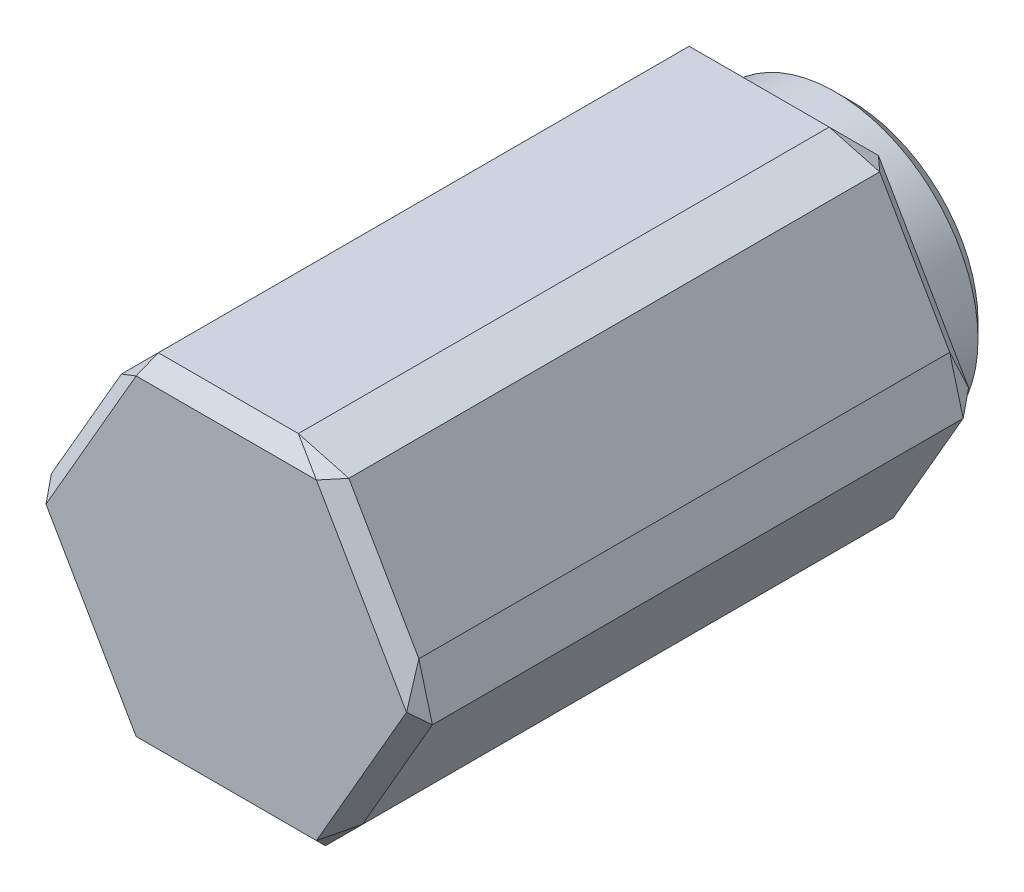
ISO-10303-21;
HEADER;
FILE_DESCRIPTION(('STEP AP214'),'2;1');
FILE_NAME('part.step','',(''),(''),'','','');
FILE_SCHEMA(('AUTOMOTIVE_DESIGN { 1 0 10303 214 1 1 1 1 }'));
ENDSEC;
DATA;
#1=APPLICATION_CONTEXT('core data for automotive mechanical design processes');
#2=APPLICATION_PROTOCOL_DEFINITION('international standard','automotive_design',2000,#1);
#3=PRODUCT_CONTEXT('',#1,'mechanical');
#4=PRODUCT('Part','Part','',(#3));
#5=PRODUCT_RELATED_PRODUCT_CATEGORY('part','',(#4));
#6=PRODUCT_DEFINITION_FORMATION('','',#4);
#7=PRODUCT_DEFINITION_CONTEXT('part definition',#1,'design');
#8=PRODUCT_DEFINITION('design','',#6,#7);
#9=PRODUCT_DEFINITION_SHAPE('','',#8);
#10=(LENGTH_UNIT() NAMED_UNIT(*) SI_UNIT(.MILLI.,.METRE.));
#11=(NAMED_UNIT(*) PLANE_ANGLE_UNIT() SI_UNIT($,.RADIAN.));
#12=(NAMED_UNIT(*) SI_UNIT($,.STERADIAN.) SOLID_ANGLE_UNIT());
#13=UNCERTAINTY_MEASURE_WITH_UNIT(LENGTH_MEASURE(1.E-05),#10,'distance_accuracy_value','');
#14=(GEOMETRIC_REPRESENTATION_CONTEXT(3) GLOBAL_UNCERTAINTY_ASSIGNED_CONTEXT((#13)) GLOBAL_UNIT_ASSIGNED_CONTEXT((#10,
#11,#12)) REPRESENTATION_CONTEXT('',''));
#15=CARTESIAN_POINT('',(0.,0.,0.));
#16=DIRECTION('',(0.,0.,1.));
#17=DIRECTION('',(1.,0.,0.));
#18=AXIS2_PLACEMENT_3D('',#15,#16,#17);
#19=CARTESIAN_POINT('',(0.,0.,0.));
#20=DIRECTION('',(0.,0.,1.));
#21=DIRECTION('',(1.,0.,0.));
#22=AXIS2_PLACEMENT_3D('',#19,#20,#21);
#23=PLANE('',#22);
#24=CARTESIAN_POINT('',(0.,0.,0.));
#25=DIRECTION('',(0.,0.,1.));
#26=DIRECTION('',(1.,0.,0.));
#27=AXIS2_PLACEMENT_3D('',#24,#25,#26);
#28=CIRCLE('',#27,4.07499999999999);
#29=CARTESIAN_POINT('',(4.07499999999999,0.,0.));
#30=VERTEX_POINT('',#29);
#31=EDGE_CURVE('E213',#30,#30,#28,.F.);
#32=ORIENTED_EDGE('',*,*,#31,.T.);
#33=EDGE_LOOP('',(#32));
#34=FACE_BOUND('',#33,.T.);
#35=CARTESIAN_POINT('',(0.,0.,0.));
#36=DIRECTION('',(0.,0.,1.));
#37=DIRECTION('',(1.,0.,0.));
#38=AXIS2_PLACEMENT_3D('',#35,#36,#37);
#39=CIRCLE('',#38,1.65000000000001);
#40=CARTESIAN_POINT('',(1.1832491571939,-1.14996583949262,0.));
#41=VERTEX_POINT('',#40);
#42=CARTESIAN_POINT('',(-1.1832491571939,-1.14996583949261,0.));
#43=VERTEX_POINT('',#42);
#44=EDGE_CURVE('E61',#41,#43,#39,.T.);
#45=ORIENTED_EDGE('',*,*,#44,.T.);
#46=DIRECTION('',(1.,0.,0.));
#47=VECTOR('',#46,1.);
#48=CARTESIAN_POINT('',(1.1832491571939,-1.14996583949262,0.));
#49=LINE('',#48,#47);
#50=EDGE_CURVE('E196',#43,#41,#49,.T.);
#51=ORIENTED_EDGE('',*,*,#50,.T.);
#52=EDGE_LOOP('',(#45,#51));
#53=FACE_BOUND('',#52,.T.);
#54=ADVANCED_FACE('F43',(#34,#53),#23,.F.);
#55=CARTESIAN_POINT('',(0.,0.,2.));
#56=DIRECTION('',(0.,0.,-1.));
#57=DIRECTION('',(-1.,0.,0.));
#58=AXIS2_PLACEMENT_3D('',#55,#56,#57);
#59=CYLINDRICAL_SURFACE('',#58,4.575);
#60=CARTESIAN_POINT('',(0.,0.,0.500000000000007));
#61=DIRECTION('',(0.,0.,1.));
#62=DIRECTION('',(1.,0.,0.));
#63=AXIS2_PLACEMENT_3D('',#60,#61,#62);
#64=CIRCLE('',#63,4.575);
#65=CARTESIAN_POINT('',(4.575,0.,0.500000000000007));
#66=VERTEX_POINT('',#65);
#67=EDGE_CURVE('E210',#66,#66,#64,.T.);
#68=ORIENTED_EDGE('',*,*,#67,.T.);
#69=EDGE_LOOP('',(#68));
#70=FACE_BOUND('',#69,.T.);
#71=CARTESIAN_POINT('',(0.,0.,2.));
#72=DIRECTION('',(0.,0.,1.));
#73=DIRECTION('',(1.,0.,0.));
#74=AXIS2_PLACEMENT_3D('',#71,#72,#73);
#75=CIRCLE('',#74,4.575);
#76=CARTESIAN_POINT('',(4.575,0.,2.));
#77=VERTEX_POINT('',#76);
#78=EDGE_CURVE('E207',#77,#77,#75,.T.);
#79=ORIENTED_EDGE('',*,*,#78,.F.);
#80=EDGE_LOOP('',(#79));
#81=FACE_BOUND('',#80,.T.);
#82=ADVANCED_FACE('F478',(#70,#81),#59,.T.);
#83=CARTESIAN_POINT('',(3.17542648054294,-5.5,20.));
#84=DIRECTION('',(-0.866025403784439,0.5,0.));
#85=DIRECTION('',(-0.5,-0.866025403784439,0.));
#86=AXIS2_PLACEMENT_3D('',#83,#84,#85);
#87=PLANE('',#86);
#88=DIRECTION('',(0.,0.,1.));
#89=VECTOR('',#88,1.);
#90=CARTESIAN_POINT('',(6.10085296108588,-0.433012701892217,20.));
#91=LINE('',#90,#89);
#92=CARTESIAN_POINT('',(6.10085296108588,-0.433012701892218,2.5));
#93=VERTEX_POINT('',#92);
#94=CARTESIAN_POINT('',(6.10085296108588,-0.433012701892218,19.5));
#95=VERTEX_POINT('',#94);
#96=EDGE_CURVE('E218',#93,#95,#91,.T.);
#97=ORIENTED_EDGE('',*,*,#96,.T.);
#98=DIRECTION('',(-0.5,-0.866025403784439,0.));
#99=VECTOR('',#98,1.);
#100=CARTESIAN_POINT('',(3.17542648054294,-5.5,19.5));
#101=LINE('',#100,#99);
#102=CARTESIAN_POINT('',(3.85843918243516,-4.31698729810779,19.5));
#103=VERTEX_POINT('',#102);
#104=EDGE_CURVE('E223',#95,#103,#101,.T.);
#105=ORIENTED_EDGE('',*,*,#104,.T.);
#106=DIRECTION('',(0.,0.,-1.));
#107=VECTOR('',#106,1.);
#108=CARTESIAN_POINT('',(3.85843918243516,-4.31698729810779,20.));
#109=LINE('',#108,#107);
#110=CARTESIAN_POINT('',(3.85843918243516,-4.31698729810779,2.5));
#111=VERTEX_POINT('',#110);
#112=EDGE_CURVE('E220',#103,#111,#109,.T.);
#113=ORIENTED_EDGE('',*,*,#112,.T.);
#114=DIRECTION('',(0.5,0.866025403784439,0.));
#115=VECTOR('',#114,1.);
#116=CARTESIAN_POINT('',(3.17542648054294,-5.5,2.5));
#117=LINE('',#116,#115);
#118=EDGE_CURVE('E216',#111,#93,#117,.T.);
#119=ORIENTED_EDGE('',*,*,#118,.T.);
#120=EDGE_LOOP('',(#97,#105,#113,#119));
#121=FACE_BOUND('',#120,.T.);
#122=ADVANCED_FACE('F486',(#121),#87,.F.);
#123=CARTESIAN_POINT('',(6.35085296108588,0.,20.));
#124=DIRECTION('',(-0.866025403784438,-0.5,0.));
#125=DIRECTION('',(0.5,-0.866025403784439,0.));
#126=AXIS2_PLACEMENT_3D('',#123,#124,#125);
#127=PLANE('',#126);
#128=DIRECTION('',(0.5,-0.866025403784439,0.));
#129=VECTOR('',#128,1.);
#130=CARTESIAN_POINT('',(6.35085296108588,0.,19.5));
#131=LINE('',#130,#129);
#132=CARTESIAN_POINT('',(3.42542648054294,5.06698729810778,19.5));
#133=VERTEX_POINT('',#132);
#134=CARTESIAN_POINT('',(5.66784025919367,1.18301270189221,19.5));
#135=VERTEX_POINT('',#134);
#136=EDGE_CURVE('E265',#133,#135,#131,.T.);
#137=ORIENTED_EDGE('',*,*,#136,.T.);
#138=DIRECTION('',(0.,0.,-1.));
#139=VECTOR('',#138,1.);
#140=CARTESIAN_POINT('',(5.66784025919367,1.18301270189221,20.));
#141=LINE('',#140,#139);
#142=CARTESIAN_POINT('',(5.66784025919367,1.18301270189221,2.5));
#143=VERTEX_POINT('',#142);
#144=EDGE_CURVE('E267',#135,#143,#141,.T.);
#145=ORIENTED_EDGE('',*,*,#144,.T.);
#146=DIRECTION('',(-0.5,0.866025403784439,0.));
#147=VECTOR('',#146,1.);
#148=CARTESIAN_POINT('',(6.35085296108588,0.,2.5));
#149=LINE('',#148,#147);
#150=CARTESIAN_POINT('',(3.42542648054294,5.06698729810778,2.5));
#151=VERTEX_POINT('',#150);
#152=EDGE_CURVE('E261',#143,#151,#149,.T.);
#153=ORIENTED_EDGE('',*,*,#152,.T.);
#154=DIRECTION('',(0.,0.,1.));
#155=VECTOR('',#154,1.);
#156=CARTESIAN_POINT('',(3.42542648054294,5.06698729810778,20.));
#157=LINE('',#156,#155);
#158=EDGE_CURVE('E263',#151,#133,#157,.T.);
#159=ORIENTED_EDGE('',*,*,#158,.T.);
#160=EDGE_LOOP('',(#137,#145,#153,#159));
#161=FACE_BOUND('',#160,.T.);
#162=ADVANCED_FACE('F703',(#161),#127,.F.);
#163=CARTESIAN_POINT('',(3.17542648054294,5.5,20.));
#164=DIRECTION('',(0.,-1.,0.));
#165=DIRECTION('',(0.,0.,-1.));
#166=AXIS2_PLACEMENT_3D('',#163,#164,#165);
#167=PLANE('',#166);
#168=DIRECTION('',(-1.,0.,0.));
#169=VECTOR('',#168,1.);
#170=CARTESIAN_POINT('',(3.17542648054294,5.5,2.5));
#171=LINE('',#170,#169);
#172=CARTESIAN_POINT('',(1.8094010767585,5.5,2.5));
#173=VERTEX_POINT('',#172);
#174=CARTESIAN_POINT('',(-2.67542648054294,5.5,2.5));
#175=VERTEX_POINT('',#174);
#176=EDGE_CURVE('E252',#173,#175,#171,.T.);
#177=ORIENTED_EDGE('',*,*,#176,.T.);
#178=DIRECTION('',(0.,0.,1.));
#179=VECTOR('',#178,1.);
#180=CARTESIAN_POINT('',(-2.67542648054294,5.5,20.));
#181=LINE('',#180,#179);
#182=CARTESIAN_POINT('',(-2.67542648054294,5.5,19.5));
#183=VERTEX_POINT('',#182);
#184=EDGE_CURVE('E258',#175,#183,#181,.T.);
#185=ORIENTED_EDGE('',*,*,#184,.T.);
#186=DIRECTION('',(1.,0.,0.));
#187=VECTOR('',#186,1.);
#188=CARTESIAN_POINT('',(3.17542648054294,5.5,19.5));
#189=LINE('',#188,#187);
#190=CARTESIAN_POINT('',(1.8094010767585,5.5,19.5));
#191=VERTEX_POINT('',#190);
#192=EDGE_CURVE('E256',#183,#191,#189,.T.);
#193=ORIENTED_EDGE('',*,*,#192,.T.);
#194=DIRECTION('',(0.,0.,-1.));
#195=VECTOR('',#194,1.);
#196=CARTESIAN_POINT('',(1.8094010767585,5.5,20.));
#197=LINE('',#196,#195);
#198=EDGE_CURVE('E254',#191,#173,#197,.T.);
#199=ORIENTED_EDGE('',*,*,#198,.T.);
#200=EDGE_LOOP('',(#177,#185,#193,#199));
#201=FACE_BOUND('',#200,.T.);
#202=ADVANCED_FACE('F415',(#201),#167,.F.);
#203=CARTESIAN_POINT('',(-3.17542648054294,5.5,20.));
#204=DIRECTION('',(0.866025403784439,-0.5,0.));
#205=DIRECTION('',(0.5,0.866025403784439,0.));
#206=AXIS2_PLACEMENT_3D('',#203,#204,#205);
#207=PLANE('',#206);
#208=DIRECTION('',(0.,0.,1.));
#209=VECTOR('',#208,1.);
#210=CARTESIAN_POINT('',(-6.10085296108588,0.433012701892219,20.));
#211=LINE('',#210,#209);
#212=CARTESIAN_POINT('',(-6.10085296108588,0.433012701892219,2.5));
#213=VERTEX_POINT('',#212);
#214=CARTESIAN_POINT('',(-6.10085296108588,0.433012701892219,19.5));
#215=VERTEX_POINT('',#214);
#216=EDGE_CURVE('E245',#213,#215,#211,.T.);
#217=ORIENTED_EDGE('',*,*,#216,.T.);
#218=DIRECTION('',(0.5,0.866025403784439,0.));
#219=VECTOR('',#218,1.);
#220=CARTESIAN_POINT('',(-3.17542648054294,5.5,19.5));
#221=LINE('',#220,#219);
#222=CARTESIAN_POINT('',(-3.85843918243516,4.31698729810778,19.5));
#223=VERTEX_POINT('',#222);
#224=EDGE_CURVE('E250',#215,#223,#221,.T.);
#225=ORIENTED_EDGE('',*,*,#224,.T.);
#226=DIRECTION('',(0.,0.,-1.));
#227=VECTOR('',#226,1.);
#228=CARTESIAN_POINT('',(-3.85843918243516,4.31698729810778,20.));
#229=LINE('',#228,#227);
#230=CARTESIAN_POINT('',(-3.85843918243516,4.31698729810778,2.5));
#231=VERTEX_POINT('',#230);
#232=EDGE_CURVE('E247',#223,#231,#229,.T.);
#233=ORIENTED_EDGE('',*,*,#232,.T.);
#234=DIRECTION('',(-0.5,-0.866025403784439,0.));
#235=VECTOR('',#234,1.);
#236=CARTESIAN_POINT('',(-3.17542648054294,5.5,2.5));
#237=LINE('',#236,#235);
#238=EDGE_CURVE('E243',#231,#213,#237,.T.);
#239=ORIENTED_EDGE('',*,*,#238,.T.);
#240=EDGE_LOOP('',(#217,#225,#233,#239));
#241=FACE_BOUND('',#240,.T.);
#242=ADVANCED_FACE('F432',(#241),#207,.F.);
#243=CARTESIAN_POINT('',(-6.35085296108588,0.,20.));
#244=DIRECTION('',(0.866025403784439,0.5,0.));
#245=DIRECTION('',(-0.5,0.866025403784439,0.));
#246=AXIS2_PLACEMENT_3D('',#243,#244,#245);
#247=PLANE('',#246);
#248=DIRECTION('',(0.,0.,1.));
#249=VECTOR('',#248,1.);
#250=CARTESIAN_POINT('',(-3.42542648054294,-5.06698729810778,20.));
#251=LINE('',#250,#249);
#252=CARTESIAN_POINT('',(-3.42542648054294,-5.06698729810778,2.5));
#253=VERTEX_POINT('',#252);
#254=CARTESIAN_POINT('',(-3.42542648054294,-5.06698729810778,19.5));
#255=VERTEX_POINT('',#254);
#256=EDGE_CURVE('E238',#253,#255,#251,.T.);
#257=ORIENTED_EDGE('',*,*,#256,.T.);
#258=DIRECTION('',(-0.5,0.866025403784439,0.));
#259=VECTOR('',#258,1.);
#260=CARTESIAN_POINT('',(-6.35085296108588,0.,19.5));
#261=LINE('',#260,#259);
#262=CARTESIAN_POINT('',(-5.66784025919367,-1.1830127018922,19.5));
#263=VERTEX_POINT('',#262);
#264=EDGE_CURVE('E241',#255,#263,#261,.T.);
#265=ORIENTED_EDGE('',*,*,#264,.T.);
#266=DIRECTION('',(0.,0.,-1.));
#267=VECTOR('',#266,1.);
#268=CARTESIAN_POINT('',(-5.66784025919367,-1.1830127018922,20.));
#269=LINE('',#268,#267);
#270=CARTESIAN_POINT('',(-5.66784025919367,-1.1830127018922,2.5));
#271=VERTEX_POINT('',#270);
#272=EDGE_CURVE('E236',#263,#271,#269,.T.);
#273=ORIENTED_EDGE('',*,*,#272,.T.);
#274=DIRECTION('',(0.5,-0.866025403784439,0.));
#275=VECTOR('',#274,1.);
#276=CARTESIAN_POINT('',(-6.35085296108588,0.,2.5));
#277=LINE('',#276,#275);
#278=EDGE_CURVE('E234',#271,#253,#277,.T.);
#279=ORIENTED_EDGE('',*,*,#278,.T.);
#280=EDGE_LOOP('',(#257,#265,#273,#279));
#281=FACE_BOUND('',#280,.T.);
#282=ADVANCED_FACE('F452',(#281),#247,.F.);
#283=CARTESIAN_POINT('',(-3.17542648054294,-5.5,20.));
#284=DIRECTION('',(0.,1.,0.));
#285=DIRECTION('',(-1.,0.,0.));
#286=AXIS2_PLACEMENT_3D('',#283,#284,#285);
#287=PLANE('',#286);
#288=DIRECTION('',(0.,0.,1.));
#289=VECTOR('',#288,1.);
#290=CARTESIAN_POINT('',(2.67542648054294,-5.5,20.));
#291=LINE('',#290,#289);
#292=CARTESIAN_POINT('',(2.67542648054294,-5.5,2.5));
#293=VERTEX_POINT('',#292);
#294=CARTESIAN_POINT('',(2.67542648054294,-5.5,19.5));
#295=VERTEX_POINT('',#294);
#296=EDGE_CURVE('E229',#293,#295,#291,.T.);
#297=ORIENTED_EDGE('',*,*,#296,.T.);
#298=DIRECTION('',(-1.,0.,0.));
#299=VECTOR('',#298,1.);
#300=CARTESIAN_POINT('',(-3.17542648054294,-5.5,19.5));
#301=LINE('',#300,#299);
#302=CARTESIAN_POINT('',(-1.80940107675852,-5.5,19.5));
#303=VERTEX_POINT('',#302);
#304=EDGE_CURVE('E232',#295,#303,#301,.T.);
#305=ORIENTED_EDGE('',*,*,#304,.T.);
#306=DIRECTION('',(0.,0.,-1.));
#307=VECTOR('',#306,1.);
#308=CARTESIAN_POINT('',(-1.80940107675852,-5.5,20.));
#309=LINE('',#308,#307);
#310=CARTESIAN_POINT('',(-1.80940107675852,-5.5,2.5));
#311=VERTEX_POINT('',#310);
#312=EDGE_CURVE('E227',#303,#311,#309,.T.);
#313=ORIENTED_EDGE('',*,*,#312,.T.);
#314=DIRECTION('',(1.,0.,0.));
#315=VECTOR('',#314,1.);
#316=CARTESIAN_POINT('',(-3.17542648054294,-5.5,2.5));
#317=LINE('',#316,#315);
#318=EDGE_CURVE('E225',#311,#293,#317,.T.);
#319=ORIENTED_EDGE('',*,*,#318,.T.);
#320=EDGE_LOOP('',(#297,#305,#313,#319));
#321=FACE_BOUND('',#320,.T.);
#322=ADVANCED_FACE('F673',(#321),#287,.F.);
#323=CARTESIAN_POINT('',(0.,0.,20.));
#324=DIRECTION('',(0.,0.,1.));
#325=DIRECTION('',(1.,0.,0.));
#326=AXIS2_PLACEMENT_3D('',#323,#324,#325);
#327=PLANE('',#326);
#328=DIRECTION('',(1.,0.,0.));
#329=VECTOR('',#328,1.);
#330=CARTESIAN_POINT('',(3.17542648054294,-5.,20.));
#331=LINE('',#330,#329);
#332=CARTESIAN_POINT('',(-2.88675134594813,-5.,20.));
#333=VERTEX_POINT('',#332);
#334=CARTESIAN_POINT('',(2.88675134594813,-5.,20.));
#335=VERTEX_POINT('',#334);
#336=EDGE_CURVE('E278',#333,#335,#331,.T.);
#337=ORIENTED_EDGE('',*,*,#336,.T.);
#338=DIRECTION('',(0.5,0.866025403784439,0.));
#339=VECTOR('',#338,1.);
#340=CARTESIAN_POINT('',(5.91784025919367,0.249999999999999,20.));
#341=LINE('',#340,#339);
#342=CARTESIAN_POINT('',(5.77350269189626,0.,20.));
#343=VERTEX_POINT('',#342);
#344=EDGE_CURVE('E280',#335,#343,#341,.T.);
#345=ORIENTED_EDGE('',*,*,#344,.T.);
#346=DIRECTION('',(-0.5,0.866025403784439,0.));
#347=VECTOR('',#346,1.);
#348=CARTESIAN_POINT('',(2.74241377865072,5.25,20.));
#349=LINE('',#348,#347);
#350=CARTESIAN_POINT('',(2.88675134594813,5.,20.));
#351=VERTEX_POINT('',#350);
#352=EDGE_CURVE('E270',#343,#351,#349,.T.);
#353=ORIENTED_EDGE('',*,*,#352,.T.);
#354=DIRECTION('',(-1.,0.,0.));
#355=VECTOR('',#354,1.);
#356=CARTESIAN_POINT('',(-3.17542648054294,5.,20.));
#357=LINE('',#356,#355);
#358=CARTESIAN_POINT('',(-2.88675134594813,5.,20.));
#359=VERTEX_POINT('',#358);
#360=EDGE_CURVE('E272',#351,#359,#357,.T.);
#361=ORIENTED_EDGE('',*,*,#360,.T.);
#362=DIRECTION('',(-0.5,-0.866025403784439,0.));
#363=VECTOR('',#362,1.);
#364=CARTESIAN_POINT('',(-5.91784025919366,-0.249999999999999,20.));
#365=LINE('',#364,#363);
#366=CARTESIAN_POINT('',(-5.77350269189626,0.,20.));
#367=VERTEX_POINT('',#366);
#368=EDGE_CURVE('E274',#359,#367,#365,.T.);
#369=ORIENTED_EDGE('',*,*,#368,.T.);
#370=DIRECTION('',(0.5,-0.866025403784439,0.));
#371=VECTOR('',#370,1.);
#372=CARTESIAN_POINT('',(-2.74241377865072,-5.25,20.));
#373=LINE('',#372,#371);
#374=EDGE_CURVE('E276',#367,#333,#373,.T.);
#375=ORIENTED_EDGE('',*,*,#374,.T.);
#376=EDGE_LOOP('',(#337,#345,#353,#361,#369,#375));
#377=FACE_BOUND('',#376,.T.);
#378=ADVANCED_FACE('F405',(#377),#327,.T.);
#379=CARTESIAN_POINT('',(0.,0.,2.));
#380=DIRECTION('',(0.,0.,1.));
#381=DIRECTION('',(1.,0.,0.));
#382=AXIS2_PLACEMENT_3D('',#379,#380,#381);
#383=PLANE('',#382);
#384=DIRECTION('',(0.5,-0.866025403784439,0.));
#385=VECTOR('',#384,1.);
#386=CARTESIAN_POINT('',(4.33012701892219,2.5,2.));
#387=LINE('',#386,#385);
#388=CARTESIAN_POINT('',(2.88675134594813,5.,2.));
#389=VERTEX_POINT('',#388);
#390=CARTESIAN_POINT('',(5.77350269189625,0.,2.));
#391=VERTEX_POINT('',#390);
#392=EDGE_CURVE('E283',#389,#391,#387,.T.);
#393=ORIENTED_EDGE('',*,*,#392,.T.);
#394=DIRECTION('',(-0.5,-0.866025403784439,0.));
#395=VECTOR('',#394,1.);
#396=CARTESIAN_POINT('',(4.33012701892219,-2.5,2.));
#397=LINE('',#396,#395);
#398=CARTESIAN_POINT('',(2.88675134594813,-5.,2.));
#399=VERTEX_POINT('',#398);
#400=EDGE_CURVE('E11',#391,#399,#397,.T.);
#401=ORIENTED_EDGE('',*,*,#400,.T.);
#402=DIRECTION('',(-1.,0.,0.));
#403=VECTOR('',#402,1.);
#404=CARTESIAN_POINT('',(0.,-5.,2.));
#405=LINE('',#404,#403);
#406=CARTESIAN_POINT('',(-2.88675134594813,-5.,2.));
#407=VERTEX_POINT('',#406);
#408=EDGE_CURVE('E53',#399,#407,#405,.T.);
#409=ORIENTED_EDGE('',*,*,#408,.T.);
#410=DIRECTION('',(-0.5,0.866025403784439,0.));
#411=VECTOR('',#410,1.);
#412=CARTESIAN_POINT('',(-4.33012701892219,-2.5,2.));
#413=LINE('',#412,#411);
#414=CARTESIAN_POINT('',(-5.77350269189626,0.,2.));
#415=VERTEX_POINT('',#414);
#416=EDGE_CURVE('E289',#407,#415,#413,.T.);
#417=ORIENTED_EDGE('',*,*,#416,.T.);
#418=DIRECTION('',(0.5,0.866025403784439,0.));
#419=VECTOR('',#418,1.);
#420=CARTESIAN_POINT('',(-4.33012701892219,2.5,2.));
#421=LINE('',#420,#419);
#422=CARTESIAN_POINT('',(-2.88675134594813,5.,2.));
#423=VERTEX_POINT('',#422);
#424=EDGE_CURVE('E287',#415,#423,#421,.T.);
#425=ORIENTED_EDGE('',*,*,#424,.T.);
#426=DIRECTION('',(1.,0.,0.));
#427=VECTOR('',#426,1.);
#428=CARTESIAN_POINT('',(0.,5.,2.));
#429=LINE('',#428,#427);
#430=EDGE_CURVE('E285',#423,#389,#429,.T.);
#431=ORIENTED_EDGE('',*,*,#430,.T.);
#432=EDGE_LOOP('',(#393,#401,#409,#417,#425,#431));
#433=FACE_BOUND('',#432,.T.);
#434=ORIENTED_EDGE('',*,*,#78,.T.);
#435=EDGE_LOOP('',(#434));
#436=FACE_BOUND('',#435,.T.);
#437=ADVANCED_FACE('F499',(#433,#436),#383,.F.);
#438=CARTESIAN_POINT('',(0.,0.,0.500000000000007));
#439=DIRECTION('',(0.,0.,1.));
#440=DIRECTION('',(1.,0.,0.));
#441=AXIS2_PLACEMENT_3D('',#438,#439,#440);
#442=CONICAL_SURFACE('',#441,4.575,0.78539816339745);
#443=ORIENTED_EDGE('',*,*,#31,.F.);
#444=EDGE_LOOP('',(#443));
#445=FACE_BOUND('',#444,.T.);
#446=ORIENTED_EDGE('',*,*,#67,.F.);
#447=EDGE_LOOP('',(#446));
#448=FACE_BOUND('',#447,.T.);
#449=ADVANCED_FACE('F494',(#445,#448),#442,.T.);
#450=CARTESIAN_POINT('',(-3.85843918243516,4.31698729810778,20.));
#451=DIRECTION('',(0.707106781186546,-0.707106781186549,0.));
#452=DIRECTION('',(0.,0.,-1.));
#453=AXIS2_PLACEMENT_3D('',#450,#451,#452);
#454=PLANE('',#453);
#455=DIRECTION('',(0.707106781186549,0.707106781186546,0.));
#456=VECTOR('',#455,1.);
#457=CARTESIAN_POINT('',(-2.67542648054294,5.5,19.5));
#458=LINE('',#457,#456);
#459=EDGE_CURVE('E48',#183,#223,#458,.F.);
#460=ORIENTED_EDGE('',*,*,#459,.F.);
#461=ORIENTED_EDGE('',*,*,#184,.F.);
#462=DIRECTION('',(-0.707106781186549,-0.707106781186546,0.));
#463=VECTOR('',#462,1.);
#464=CARTESIAN_POINT('',(-3.85843918243516,4.31698729810778,2.5));
#465=LINE('',#464,#463);
#466=EDGE_CURVE('E382',#231,#175,#465,.F.);
#467=ORIENTED_EDGE('',*,*,#466,.F.);
#468=ORIENTED_EDGE('',*,*,#232,.F.);
#469=EDGE_LOOP('',(#460,#461,#467,#468));
#470=FACE_BOUND('',#469,.T.);
#471=ADVANCED_FACE('F46',(#470),#454,.F.);
#472=CARTESIAN_POINT('',(-2.67542648054294,5.5,19.5));
#473=DIRECTION('',(-0.654653670707977,0.654653670707981,0.377964473009222));
#474=DIRECTION('',(-0.707106781186549,-0.707106781186546,0.));
#475=AXIS2_PLACEMENT_3D('',#472,#473,#474);
#476=PLANE('',#475);
#477=DIRECTION('',(0.286344323664984,0.677497944020807,-0.677497944020809));
#478=VECTOR('',#477,1.);
#479=CARTESIAN_POINT('',(-2.67542648054294,5.5,19.5));
#480=LINE('',#479,#478);
#481=EDGE_CURVE('E377',#183,#359,#480,.F.);
#482=ORIENTED_EDGE('',*,*,#481,.F.);
#483=ORIENTED_EDGE('',*,*,#459,.T.);
#484=DIRECTION('',(0.75402078491454,0.530011547174744,0.387995381130103));
#485=VECTOR('',#484,1.);
#486=CARTESIAN_POINT('',(-2.71306158448751,5.12208891457891,20.0893752885127));
#487=LINE('',#486,#485);
#488=EDGE_CURVE('E380',#359,#223,#487,.F.);
#489=ORIENTED_EDGE('',*,*,#488,.F.);
#490=EDGE_LOOP('',(#482,#483,#489));
#491=FACE_BOUND('',#490,.T.);
#492=ADVANCED_FACE('F393',(#491),#476,.T.);
#493=CARTESIAN_POINT('',(-3.85843918243516,4.31698729810778,2.5));
#494=DIRECTION('',(-0.654653670707976,0.654653670707979,-0.377964473009226));
#495=DIRECTION('',(-0.707106781186549,-0.707106781186546,0.));
#496=AXIS2_PLACEMENT_3D('',#493,#494,#495);
#497=PLANE('',#496);
#498=DIRECTION('',(0.754020784914542,0.530011547174742,-0.387995381130104));
#499=VECTOR('',#498,1.);
#500=CARTESIAN_POINT('',(-3.85843918243516,4.31698729810778,2.5));
#501=LINE('',#500,#499);
#502=EDGE_CURVE('E371',#231,#423,#501,.T.);
#503=ORIENTED_EDGE('',*,*,#502,.F.);
#504=ORIENTED_EDGE('',*,*,#466,.T.);
#505=DIRECTION('',(0.286344323664981,0.677497944020809,0.677497944020808));
#506=VECTOR('',#505,1.);
#507=CARTESIAN_POINT('',(-3.00192705790168,4.72749133961894,1.72749133961894));
#508=LINE('',#507,#506);
#509=EDGE_CURVE('E374',#423,#175,#508,.T.);
#510=ORIENTED_EDGE('',*,*,#509,.F.);
#511=EDGE_LOOP('',(#503,#504,#510));
#512=FACE_BOUND('',#511,.T.);
#513=ADVANCED_FACE('F642',(#512),#497,.T.);
#514=CARTESIAN_POINT('',(-4.33012701892219,2.5,20.));
#515=DIRECTION('',(-0.612372435695795,0.353553390593274,0.707106781186546));
#516=DIRECTION('',(0.5,0.866025403784439,0.));
#517=AXIS2_PLACEMENT_3D('',#514,#515,#516);
#518=PLANE('',#517);
#519=ORIENTED_EDGE('',*,*,#488,.T.);
#520=ORIENTED_EDGE('',*,*,#224,.F.);
#521=DIRECTION('',(-0.443558268701258,0.586730430533749,-0.67749794402081));
#522=VECTOR('',#521,1.);
#523=CARTESIAN_POINT('',(-6.10085296108588,0.43301270189222,19.5));
#524=LINE('',#523,#522);
#525=EDGE_CURVE('E365',#367,#215,#524,.T.);
#526=ORIENTED_EDGE('',*,*,#525,.F.);
#527=ORIENTED_EDGE('',*,*,#368,.F.);
#528=EDGE_LOOP('',(#519,#520,#526,#527));
#529=FACE_BOUND('',#528,.T.);
#530=ADVANCED_FACE('F400',(#529),#518,.T.);
#531=CARTESIAN_POINT('',(0.,5.,20.));
#532=DIRECTION('',(0.,0.707106781186549,0.707106781186546));
#533=DIRECTION('',(1.,0.,0.));
#534=AXIS2_PLACEMENT_3D('',#531,#532,#533);
#535=PLANE('',#534);
#536=ORIENTED_EDGE('',*,*,#481,.T.);
#537=ORIENTED_EDGE('',*,*,#360,.F.);
#538=DIRECTION('',(0.836013856609694,-0.387995381130101,0.387995381130103));
#539=VECTOR('',#538,1.);
#540=CARTESIAN_POINT('',(1.8094010767585,5.5,19.5));
#541=LINE('',#540,#539);
#542=EDGE_CURVE('E362',#191,#351,#541,.T.);
#543=ORIENTED_EDGE('',*,*,#542,.F.);
#544=ORIENTED_EDGE('',*,*,#192,.F.);
#545=EDGE_LOOP('',(#536,#537,#543,#544));
#546=FACE_BOUND('',#545,.T.);
#547=ADVANCED_FACE('F412',(#546),#535,.T.);
#548=CARTESIAN_POINT('',(1.8094010767585,5.5,20.));
#549=DIRECTION('',(-0.258819045102522,-0.965925826289068,0.));
#550=DIRECTION('',(0.,0.,-1.));
#551=AXIS2_PLACEMENT_3D('',#548,#549,#550);
#552=PLANE('',#551);
#553=DIRECTION('',(-0.965925826289068,0.258819045102522,0.));
#554=VECTOR('',#553,1.);
#555=CARTESIAN_POINT('',(1.8094010767585,5.5,2.5));
#556=LINE('',#555,#554);
#557=EDGE_CURVE('E356',#173,#151,#556,.F.);
#558=ORIENTED_EDGE('',*,*,#557,.F.);
#559=ORIENTED_EDGE('',*,*,#198,.F.);
#560=DIRECTION('',(0.965925826289068,-0.258819045102522,0.));
#561=VECTOR('',#560,1.);
#562=CARTESIAN_POINT('',(1.8094010767585,5.5,19.5));
#563=LINE('',#562,#561);
#564=EDGE_CURVE('E359',#133,#191,#563,.F.);
#565=ORIENTED_EDGE('',*,*,#564,.F.);
#566=ORIENTED_EDGE('',*,*,#158,.F.);
#567=EDGE_LOOP('',(#558,#559,#565,#566));
#568=FACE_BOUND('',#567,.T.);
#569=ADVANCED_FACE('F420',(#568),#552,.F.);
#570=CARTESIAN_POINT('',(3.17542648054294,5.5,2.5));
#571=DIRECTION('',(0.,-0.707106781186547,0.707106781186548));
#572=DIRECTION('',(-1.,0.,0.));
#573=AXIS2_PLACEMENT_3D('',#570,#571,#572);
#574=PLANE('',#573);
#575=ORIENTED_EDGE('',*,*,#509,.T.);
#576=ORIENTED_EDGE('',*,*,#176,.F.);
#577=DIRECTION('',(0.836013856609692,-0.387995381130104,-0.387995381130104));
#578=VECTOR('',#577,1.);
#579=CARTESIAN_POINT('',(1.8094010767585,5.5,2.5));
#580=LINE('',#579,#578);
#581=EDGE_CURVE('E353',#389,#173,#580,.F.);
#582=ORIENTED_EDGE('',*,*,#581,.F.);
#583=ORIENTED_EDGE('',*,*,#430,.F.);
#584=EDGE_LOOP('',(#575,#576,#582,#583));
#585=FACE_BOUND('',#584,.T.);
#586=ADVANCED_FACE('F430',(#585),#574,.F.);
#587=CARTESIAN_POINT('',(-3.17542648054294,5.5,2.5));
#588=DIRECTION('',(0.612372435695795,-0.353553390593274,0.707106781186547));
#589=DIRECTION('',(-0.5,-0.866025403784439,0.));
#590=AXIS2_PLACEMENT_3D('',#587,#588,#589);
#591=PLANE('',#590);
#592=ORIENTED_EDGE('',*,*,#502,.T.);
#593=ORIENTED_EDGE('',*,*,#424,.F.);
#594=DIRECTION('',(-0.443558268701261,0.586730430533747,0.67749794402081));
#595=VECTOR('',#594,1.);
#596=CARTESIAN_POINT('',(-5.59509112523177,-0.235999422641252,1.72749133961895));
#597=LINE('',#596,#595);
#598=EDGE_CURVE('E350',#213,#415,#597,.F.);
#599=ORIENTED_EDGE('',*,*,#598,.F.);
#600=ORIENTED_EDGE('',*,*,#238,.F.);
#601=EDGE_LOOP('',(#592,#593,#599,#600));
#602=FACE_BOUND('',#601,.T.);
#603=ADVANCED_FACE('F442',(#602),#591,.F.);
#604=CARTESIAN_POINT('',(-5.66784025919367,-1.1830127018922,20.));
#605=DIRECTION('',(0.965925826289069,0.258819045102519,0.));
#606=DIRECTION('',(0.,0.,-1.));
#607=AXIS2_PLACEMENT_3D('',#604,#605,#606);
#608=PLANE('',#607);
#609=DIRECTION('',(-0.258819045102519,0.965925826289069,0.));
#610=VECTOR('',#609,1.);
#611=CARTESIAN_POINT('',(-6.10085296108588,0.433012701892219,19.5));
#612=LINE('',#611,#610);
#613=EDGE_CURVE('E368',#215,#263,#612,.F.);
#614=ORIENTED_EDGE('',*,*,#613,.F.);
#615=ORIENTED_EDGE('',*,*,#216,.F.);
#616=DIRECTION('',(0.258819045102519,-0.965925826289069,0.));
#617=VECTOR('',#616,1.);
#618=CARTESIAN_POINT('',(-5.66784025919367,-1.1830127018922,2.5));
#619=LINE('',#618,#617);
#620=EDGE_CURVE('E347',#271,#213,#619,.F.);
#621=ORIENTED_EDGE('',*,*,#620,.F.);
#622=ORIENTED_EDGE('',*,*,#272,.F.);
#623=EDGE_LOOP('',(#614,#615,#621,#622));
#624=FACE_BOUND('',#623,.T.);
#625=ADVANCED_FACE('F437',(#624),#608,.F.);
#626=CARTESIAN_POINT('',(-6.10085296108588,0.433012701892219,19.5));
#627=DIRECTION('',(-0.89427354486783,-0.23961987415985,0.377964473009226));
#628=DIRECTION('',(0.389306214312517,0.,0.921108392914567));
#629=AXIS2_PLACEMENT_3D('',#626,#627,#628);
#630=PLANE('',#629);
#631=ORIENTED_EDGE('',*,*,#525,.T.);
#632=ORIENTED_EDGE('',*,*,#613,.T.);
#633=DIRECTION('',(-0.0819930716951483,0.918006928304845,0.387995381130108));
#634=VECTOR('',#633,1.);
#635=CARTESIAN_POINT('',(-5.79238991271175,0.211464203091599,20.0893752885127));
#636=LINE('',#635,#634);
#637=EDGE_CURVE('E344',#367,#263,#636,.F.);
#638=ORIENTED_EDGE('',*,*,#637,.F.);
#639=EDGE_LOOP('',(#631,#632,#638));
#640=FACE_BOUND('',#639,.T.);
#641=ADVANCED_FACE('F465',(#640),#630,.T.);
#642=CARTESIAN_POINT('',(1.8094010767585,5.5,19.5));
#643=DIRECTION('',(0.239619874159854,0.894273544867831,0.377964473009223));
#644=DIRECTION('',(0.,-0.389306214312514,0.921108392914568));
#645=AXIS2_PLACEMENT_3D('',#642,#643,#644);
#646=PLANE('',#645);
#647=ORIENTED_EDGE('',*,*,#564,.T.);
#648=ORIENTED_EDGE('',*,*,#542,.T.);
#649=DIRECTION('',(0.729902592366237,0.0907675134870561,-0.677497944020809));
#650=VECTOR('',#649,1.);
#651=CARTESIAN_POINT('',(2.59316406733009,4.96349076226021,20.2725086603811));
#652=LINE('',#651,#650);
#653=EDGE_CURVE('E341',#133,#351,#652,.F.);
#654=ORIENTED_EDGE('',*,*,#653,.F.);
#655=EDGE_LOOP('',(#647,#648,#654));
#656=FACE_BOUND('',#655,.T.);
#657=ADVANCED_FACE('F467',(#656),#646,.T.);
#658=CARTESIAN_POINT('',(1.8094010767585,5.5,2.5));
#659=DIRECTION('',(0.239619874159853,0.894273544867828,-0.377964473009229));
#660=DIRECTION('',(0.,0.38930621431252,0.921108392914566));
#661=AXIS2_PLACEMENT_3D('',#658,#659,#660);
#662=PLANE('',#661);
#663=ORIENTED_EDGE('',*,*,#581,.T.);
#664=ORIENTED_EDGE('',*,*,#557,.T.);
#665=DIRECTION('',(0.729902592366237,0.0907675134870619,0.677497944020809));
#666=VECTOR('',#665,1.);
#667=CARTESIAN_POINT('',(2.59316406733009,4.9634907622602,1.72749133961894));
#668=LINE('',#667,#666);
#669=EDGE_CURVE('E338',#389,#151,#668,.T.);
#670=ORIENTED_EDGE('',*,*,#669,.F.);
#671=EDGE_LOOP('',(#663,#664,#670));
#672=FACE_BOUND('',#671,.T.);
#673=ADVANCED_FACE('F426',(#672),#662,.T.);
#674=CARTESIAN_POINT('',(-5.66784025919367,-1.1830127018922,2.5));
#675=DIRECTION('',(-0.894273544867829,-0.23961987415985,-0.377964473009231));
#676=DIRECTION('',(-0.389306214312521,0.,0.921108392914565));
#677=AXIS2_PLACEMENT_3D('',#674,#675,#676);
#678=PLANE('',#677);
#679=ORIENTED_EDGE('',*,*,#620,.T.);
#680=ORIENTED_EDGE('',*,*,#598,.T.);
#681=DIRECTION('',(-0.0819930716951462,0.918006928304845,-0.387995381130108));
#682=VECTOR('',#681,1.);
#683=CARTESIAN_POINT('',(-5.66784025919367,-1.1830127018922,2.5));
#684=LINE('',#683,#682);
#685=EDGE_CURVE('E335',#271,#415,#684,.T.);
#686=ORIENTED_EDGE('',*,*,#685,.F.);
#687=EDGE_LOOP('',(#679,#680,#686));
#688=FACE_BOUND('',#687,.T.);
#689=ADVANCED_FACE('F444',(#688),#678,.T.);
#690=CARTESIAN_POINT('',(-4.33012701892219,-2.5,20.));
#691=DIRECTION('',(-0.612372435695797,-0.353553390593275,0.707106781186545));
#692=DIRECTION('',(-0.5,0.866025403784439,0.));
#693=AXIS2_PLACEMENT_3D('',#690,#691,#692);
#694=PLANE('',#693);
#695=ORIENTED_EDGE('',*,*,#637,.T.);
#696=ORIENTED_EDGE('',*,*,#264,.F.);
#697=DIRECTION('',(-0.729902592366234,-0.0907675134870613,-0.677497944020812));
#698=VECTOR('',#697,1.);
#699=CARTESIAN_POINT('',(-3.42542648054294,-5.06698729810778,19.5));
#700=LINE('',#699,#698);
#701=EDGE_CURVE('E330',#333,#255,#700,.T.);
#702=ORIENTED_EDGE('',*,*,#701,.F.);
#703=ORIENTED_EDGE('',*,*,#374,.F.);
#704=EDGE_LOOP('',(#695,#696,#702,#703));
#705=FACE_BOUND('',#704,.T.);
#706=ADVANCED_FACE('F463',(#705),#694,.T.);
#707=CARTESIAN_POINT('',(4.33012701892219,2.5,20.));
#708=DIRECTION('',(0.612372435695795,0.353553390593274,0.707106781186547));
#709=DIRECTION('',(0.5,-0.866025403784439,0.));
#710=AXIS2_PLACEMENT_3D('',#707,#708,#709);
#711=PLANE('',#710);
#712=ORIENTED_EDGE('',*,*,#653,.T.);
#713=ORIENTED_EDGE('',*,*,#352,.F.);
#714=DIRECTION('',(0.0819930716951523,-0.918006928304846,0.387995381130104));
#715=VECTOR('',#714,1.);
#716=CARTESIAN_POINT('',(5.79238991271175,-0.211464203091602,20.0893752885127));
#717=LINE('',#716,#715);
#718=EDGE_CURVE('E327',#135,#343,#717,.T.);
#719=ORIENTED_EDGE('',*,*,#718,.F.);
#720=ORIENTED_EDGE('',*,*,#136,.F.);
#721=EDGE_LOOP('',(#712,#713,#719,#720));
#722=FACE_BOUND('',#721,.T.);
#723=ADVANCED_FACE('F593',(#722),#711,.T.);
#724=CARTESIAN_POINT('',(5.66784025919367,1.18301270189221,20.));
#725=DIRECTION('',(-0.965925826289069,-0.25881904510252,0.));
#726=DIRECTION('',(0.,0.,-1.));
#727=AXIS2_PLACEMENT_3D('',#724,#725,#726);
#728=PLANE('',#727);
#729=DIRECTION('',(-0.25881904510252,0.965925826289069,0.));
#730=VECTOR('',#729,1.);
#731=CARTESIAN_POINT('',(5.66784025919367,1.18301270189221,2.5));
#732=LINE('',#731,#730);
#733=EDGE_CURVE('E321',#143,#93,#732,.F.);
#734=ORIENTED_EDGE('',*,*,#733,.F.);
#735=ORIENTED_EDGE('',*,*,#144,.F.);
#736=DIRECTION('',(0.25881904510252,-0.965925826289068,0.));
#737=VECTOR('',#736,1.);
#738=CARTESIAN_POINT('',(6.10085296108588,-0.433012701892218,19.5));
#739=LINE('',#738,#737);
#740=EDGE_CURVE('E324',#95,#135,#739,.F.);
#741=ORIENTED_EDGE('',*,*,#740,.F.);
#742=ORIENTED_EDGE('',*,*,#96,.F.);
#743=EDGE_LOOP('',(#734,#735,#741,#742));
#744=FACE_BOUND('',#743,.T.);
#745=ADVANCED_FACE('F586',(#744),#728,.F.);
#746=CARTESIAN_POINT('',(6.35085296108588,0.,2.5));
#747=DIRECTION('',(-0.612372435695794,-0.353553390593274,0.707106781186548));
#748=DIRECTION('',(-0.5,0.866025403784439,0.));
#749=AXIS2_PLACEMENT_3D('',#746,#747,#748);
#750=PLANE('',#749);
#751=ORIENTED_EDGE('',*,*,#669,.T.);
#752=ORIENTED_EDGE('',*,*,#152,.F.);
#753=DIRECTION('',(0.0819930716951486,-0.918006928304846,-0.387995381130106));
#754=VECTOR('',#753,1.);
#755=CARTESIAN_POINT('',(5.66784025919367,1.18301270189221,2.5));
#756=LINE('',#755,#754);
#757=EDGE_CURVE('E319',#391,#143,#756,.F.);
#758=ORIENTED_EDGE('',*,*,#757,.F.);
#759=ORIENTED_EDGE('',*,*,#392,.F.);
#760=EDGE_LOOP('',(#751,#752,#758,#759));
#761=FACE_BOUND('',#760,.T.);
#762=ADVANCED_FACE('F580',(#761),#750,.F.);
#763=CARTESIAN_POINT('',(-6.35085296108588,0.,2.5));
#764=DIRECTION('',(0.612372435695795,0.353553390593274,0.707106781186547));
#765=DIRECTION('',(0.5,-0.866025403784439,0.));
#766=AXIS2_PLACEMENT_3D('',#763,#764,#765);
#767=PLANE('',#766);
#768=ORIENTED_EDGE('',*,*,#685,.T.);
#769=ORIENTED_EDGE('',*,*,#416,.F.);
#770=DIRECTION('',(-0.729902592366235,-0.0907675134870661,0.67749794402081));
#771=VECTOR('',#770,1.);
#772=CARTESIAN_POINT('',(-2.5931640673301,-4.9634907622602,1.72749133961895));
#773=LINE('',#772,#771);
#774=EDGE_CURVE('E316',#253,#407,#773,.F.);
#775=ORIENTED_EDGE('',*,*,#774,.F.);
#776=ORIENTED_EDGE('',*,*,#278,.F.);
#777=EDGE_LOOP('',(#768,#769,#775,#776));
#778=FACE_BOUND('',#777,.T.);
#779=ADVANCED_FACE('F449',(#778),#767,.F.);
#780=CARTESIAN_POINT('',(-1.80940107675852,-5.5,20.));
#781=DIRECTION('',(0.258819045102523,0.965925826289068,0.));
#782=DIRECTION('',(0.,0.,-1.));
#783=AXIS2_PLACEMENT_3D('',#780,#781,#782);
#784=PLANE('',#783);
#785=DIRECTION('',(-0.965925826289068,0.258819045102522,0.));
#786=VECTOR('',#785,1.);
#787=CARTESIAN_POINT('',(-3.42542648054294,-5.06698729810778,19.5));
#788=LINE('',#787,#786);
#789=EDGE_CURVE('E332',#255,#303,#788,.F.);
#790=ORIENTED_EDGE('',*,*,#789,.F.);
#791=ORIENTED_EDGE('',*,*,#256,.F.);
#792=DIRECTION('',(0.965925826289068,-0.258819045102522,0.));
#793=VECTOR('',#792,1.);
#794=CARTESIAN_POINT('',(-1.80940107675852,-5.5,2.5));
#795=LINE('',#794,#793);
#796=EDGE_CURVE('E313',#311,#253,#795,.F.);
#797=ORIENTED_EDGE('',*,*,#796,.F.);
#798=ORIENTED_EDGE('',*,*,#312,.F.);
#799=EDGE_LOOP('',(#790,#791,#797,#798));
#800=FACE_BOUND('',#799,.T.);
#801=ADVANCED_FACE('F456',(#800),#784,.F.);
#802=CARTESIAN_POINT('',(-3.42542648054294,-5.06698729810778,19.5));
#803=DIRECTION('',(-0.239619874159854,-0.894273544867829,0.377964473009227));
#804=DIRECTION('',(0.,-0.389306214312518,-0.921108392914567));
#805=AXIS2_PLACEMENT_3D('',#802,#803,#804);
#806=PLANE('',#805);
#807=ORIENTED_EDGE('',*,*,#701,.T.);
#808=ORIENTED_EDGE('',*,*,#789,.T.);
#809=DIRECTION('',(-0.83601385660969,0.387995381130105,0.387995381130107));
#810=VECTOR('',#809,1.);
#811=CARTESIAN_POINT('',(-3.07932832822423,-4.91062471148731,20.0893752885127));
#812=LINE('',#811,#810);
#813=EDGE_CURVE('E310',#333,#303,#812,.F.);
#814=ORIENTED_EDGE('',*,*,#813,.F.);
#815=EDGE_LOOP('',(#807,#808,#814));
#816=FACE_BOUND('',#815,.T.);
#817=ADVANCED_FACE('F564',(#816),#806,.T.);
#818=CARTESIAN_POINT('',(6.10085296108588,-0.433012701892218,19.5));
#819=DIRECTION('',(0.89427354486783,0.239619874159852,0.377964473009226));
#820=DIRECTION('',(0.389306214312517,0.,-0.921108392914567));
#821=AXIS2_PLACEMENT_3D('',#818,#819,#820);
#822=PLANE('',#821);
#823=ORIENTED_EDGE('',*,*,#740,.T.);
#824=ORIENTED_EDGE('',*,*,#718,.T.);
#825=DIRECTION('',(0.443558268701259,-0.586730430533746,-0.677497944020812));
#826=VECTOR('',#825,1.);
#827=CARTESIAN_POINT('',(6.10085296108588,-0.433012701892218,19.5));
#828=LINE('',#827,#826);
#829=EDGE_CURVE('E308',#95,#343,#828,.F.);
#830=ORIENTED_EDGE('',*,*,#829,.F.);
#831=EDGE_LOOP('',(#823,#824,#830));
#832=FACE_BOUND('',#831,.T.);
#833=ADVANCED_FACE('F558',(#832),#822,.T.);
#834=CARTESIAN_POINT('',(5.66784025919367,1.18301270189221,2.5));
#835=DIRECTION('',(0.894273544867828,0.239619874159851,-0.377964473009231));
#836=DIRECTION('',(-0.389306214312522,0.,-0.921108392914565));
#837=AXIS2_PLACEMENT_3D('',#834,#835,#836);
#838=PLANE('',#837);
#839=ORIENTED_EDGE('',*,*,#757,.T.);
#840=ORIENTED_EDGE('',*,*,#733,.T.);
#841=DIRECTION('',(0.443558268701262,-0.586730430533744,0.677497944020811));
#842=VECTOR('',#841,1.);
#843=CARTESIAN_POINT('',(5.59509112523177,0.235999422641254,1.72749133961895));
#844=LINE('',#843,#842);
#845=EDGE_CURVE('E305',#391,#93,#844,.T.);
#846=ORIENTED_EDGE('',*,*,#845,.F.);
#847=EDGE_LOOP('',(#839,#840,#846));
#848=FACE_BOUND('',#847,.T.);
#849=ADVANCED_FACE('F552',(#848),#838,.T.);
#850=CARTESIAN_POINT('',(-1.80940107675852,-5.5,2.5));
#851=DIRECTION('',(-0.239619874159853,-0.894273544867826,-0.377964473009233));
#852=DIRECTION('',(0.,0.389306214312525,-0.921108392914564));
#853=AXIS2_PLACEMENT_3D('',#850,#851,#852);
#854=PLANE('',#853);
#855=ORIENTED_EDGE('',*,*,#796,.T.);
#856=ORIENTED_EDGE('',*,*,#774,.T.);
#857=DIRECTION('',(-0.836013856609689,0.387995381130108,-0.387995381130107));
#858=VECTOR('',#857,1.);
#859=CARTESIAN_POINT('',(-1.80940107675852,-5.5,2.5));
#860=LINE('',#859,#858);
#861=EDGE_CURVE('E302',#311,#407,#860,.T.);
#862=ORIENTED_EDGE('',*,*,#861,.F.);
#863=EDGE_LOOP('',(#855,#856,#862));
#864=FACE_BOUND('',#863,.T.);
#865=ADVANCED_FACE('F546',(#864),#854,.T.);
#866=CARTESIAN_POINT('',(0.,-5.,20.));
#867=DIRECTION('',(0.,-0.707106781186549,0.707106781186546));
#868=DIRECTION('',(-1.,0.,0.));
#869=AXIS2_PLACEMENT_3D('',#866,#867,#868);
#870=PLANE('',#869);
#871=ORIENTED_EDGE('',*,*,#813,.T.);
#872=ORIENTED_EDGE('',*,*,#304,.F.);
#873=DIRECTION('',(-0.286344323664979,-0.677497944020807,-0.67749794402081));
#874=VECTOR('',#873,1.);
#875=CARTESIAN_POINT('',(2.67542648054294,-5.5,19.5));
#876=LINE('',#875,#874);
#877=EDGE_CURVE('E299',#335,#295,#876,.T.);
#878=ORIENTED_EDGE('',*,*,#877,.F.);
#879=ORIENTED_EDGE('',*,*,#336,.F.);
#880=EDGE_LOOP('',(#871,#872,#878,#879));
#881=FACE_BOUND('',#880,.T.);
#882=ADVANCED_FACE('F539',(#881),#870,.T.);
#883=CARTESIAN_POINT('',(4.3301270189222,-2.5,20.));
#884=DIRECTION('',(0.612372435695796,-0.353553390593275,0.707106781186545));
#885=DIRECTION('',(-0.5,-0.866025403784439,0.));
#886=AXIS2_PLACEMENT_3D('',#883,#884,#885);
#887=PLANE('',#886);
#888=ORIENTED_EDGE('',*,*,#829,.T.);
#889=ORIENTED_EDGE('',*,*,#344,.F.);
#890=DIRECTION('',(-0.75402078491454,-0.530011547174743,0.387995381130105));
#891=VECTOR('',#890,1.);
#892=CARTESIAN_POINT('',(2.71306158448752,-5.12208891457891,20.0893752885127));
#893=LINE('',#892,#891);
#894=EDGE_CURVE('E296',#103,#335,#893,.T.);
#895=ORIENTED_EDGE('',*,*,#894,.F.);
#896=ORIENTED_EDGE('',*,*,#104,.F.);
#897=EDGE_LOOP('',(#888,#889,#895,#896));
#898=FACE_BOUND('',#897,.T.);
#899=ADVANCED_FACE('F532',(#898),#887,.T.);
#900=CARTESIAN_POINT('',(3.17542648054294,-5.5,2.5));
#901=DIRECTION('',(-0.612372435695795,0.353553390593274,0.707106781186547));
#902=DIRECTION('',(0.5,0.866025403784439,0.));
#903=AXIS2_PLACEMENT_3D('',#900,#901,#902);
#904=PLANE('',#903);
#905=ORIENTED_EDGE('',*,*,#845,.T.);
#906=ORIENTED_EDGE('',*,*,#118,.F.);
#907=DIRECTION('',(-0.754020784914542,-0.53001154717474,-0.387995381130106));
#908=VECTOR('',#907,1.);
#909=CARTESIAN_POINT('',(3.85843918243516,-4.31698729810779,2.5));
#910=LINE('',#909,#908);
#911=EDGE_CURVE('E294',#399,#111,#910,.F.);
#912=ORIENTED_EDGE('',*,*,#911,.F.);
#913=ORIENTED_EDGE('',*,*,#400,.F.);
#914=EDGE_LOOP('',(#905,#906,#912,#913));
#915=FACE_BOUND('',#914,.T.);
#916=ADVANCED_FACE('F525',(#915),#904,.F.);
#917=CARTESIAN_POINT('',(-3.17542648054294,-5.5,2.5));
#918=DIRECTION('',(0.,0.707106781186547,0.707106781186548));
#919=DIRECTION('',(1.,0.,0.));
#920=AXIS2_PLACEMENT_3D('',#917,#918,#919);
#921=PLANE('',#920);
#922=ORIENTED_EDGE('',*,*,#861,.T.);
#923=ORIENTED_EDGE('',*,*,#408,.F.);
#924=DIRECTION('',(-0.286344323664976,-0.67749794402081,0.677497944020809));
#925=VECTOR('',#924,1.);
#926=CARTESIAN_POINT('',(3.00192705790168,-4.72749133961894,1.72749133961895));
#927=LINE('',#926,#925);
#928=EDGE_CURVE('E69',#293,#399,#927,.F.);
#929=ORIENTED_EDGE('',*,*,#928,.F.);
#930=ORIENTED_EDGE('',*,*,#318,.F.);
#931=EDGE_LOOP('',(#922,#923,#929,#930));
#932=FACE_BOUND('',#931,.T.);
#933=ADVANCED_FACE('F518',(#932),#921,.F.);
#934=CARTESIAN_POINT('',(2.67542648054294,-5.5,19.5));
#935=DIRECTION('',(0.654653670707977,-0.654653670707979,0.377964473009224));
#936=DIRECTION('',(0.707106781186548,0.707106781186547,0.));
#937=AXIS2_PLACEMENT_3D('',#934,#935,#936);
#938=PLANE('',#937);
#939=ORIENTED_EDGE('',*,*,#894,.T.);
#940=ORIENTED_EDGE('',*,*,#877,.T.);
#941=DIRECTION('',(-0.707106781186548,-0.707106781186547,0.));
#942=VECTOR('',#941,1.);
#943=CARTESIAN_POINT('',(2.67542648054294,-5.5,19.5));
#944=LINE('',#943,#942);
#945=EDGE_CURVE('E202',#103,#295,#944,.T.);
#946=ORIENTED_EDGE('',*,*,#945,.F.);
#947=EDGE_LOOP('',(#939,#940,#946));
#948=FACE_BOUND('',#947,.T.);
#949=ADVANCED_FACE('F513',(#948),#938,.T.);
#950=CARTESIAN_POINT('',(3.85843918243516,-4.31698729810779,2.5));
#951=DIRECTION('',(0.654653670707976,-0.654653670707977,-0.37796447300923));
#952=DIRECTION('',(0.707106781186548,0.707106781186547,0.));
#953=AXIS2_PLACEMENT_3D('',#950,#951,#952);
#954=PLANE('',#953);
#955=ORIENTED_EDGE('',*,*,#928,.T.);
#956=ORIENTED_EDGE('',*,*,#911,.T.);
#957=DIRECTION('',(0.707106781186548,0.707106781186547,0.));
#958=VECTOR('',#957,1.);
#959=CARTESIAN_POINT('',(3.85843918243516,-4.31698729810779,2.5));
#960=LINE('',#959,#958);
#961=EDGE_CURVE('E200',#293,#111,#960,.T.);
#962=ORIENTED_EDGE('',*,*,#961,.F.);
#963=EDGE_LOOP('',(#955,#956,#962));
#964=FACE_BOUND('',#963,.T.);
#965=ADVANCED_FACE('F507',(#964),#954,.T.);
#966=CARTESIAN_POINT('',(3.85843918243516,-4.31698729810779,20.));
#967=DIRECTION('',(-0.707106781186547,0.707106781186548,0.));
#968=DIRECTION('',(0.,0.,-1.));
#969=AXIS2_PLACEMENT_3D('',#966,#967,#968);
#970=PLANE('',#969);
#971=ORIENTED_EDGE('',*,*,#945,.T.);
#972=ORIENTED_EDGE('',*,*,#296,.F.);
#973=ORIENTED_EDGE('',*,*,#961,.T.);
#974=ORIENTED_EDGE('',*,*,#112,.F.);
#975=EDGE_LOOP('',(#971,#972,#973,#974));
#976=FACE_BOUND('',#975,.T.);
#977=ADVANCED_FACE('F502',(#976),#970,.F.);
#978=CARTESIAN_POINT('',(0.,0.,8.2));
#979=DIRECTION('',(0.,0.,-1.));
#980=DIRECTION('',(-1.,0.,0.));
#981=AXIS2_PLACEMENT_3D('',#978,#979,#980);
#982=CYLINDRICAL_SURFACE('',#981,1.65000000000001);
#983=ORIENTED_EDGE('',*,*,#44,.F.);
#984=DIRECTION('',(0.,0.,-1.));
#985=VECTOR('',#984,1.);
#986=CARTESIAN_POINT('',(1.1832491571939,-1.14996583949262,8.2));
#987=LINE('',#986,#985);
#988=CARTESIAN_POINT('',(1.1832491571939,-1.14996583949262,8.2));
#989=VERTEX_POINT('',#988);
#990=EDGE_CURVE('E192',#989,#41,#987,.T.);
#991=ORIENTED_EDGE('',*,*,#990,.F.);
#992=CARTESIAN_POINT('',(0.,0.,8.2));
#993=DIRECTION('',(0.,0.,1.));
#994=DIRECTION('',(1.,0.,0.));
#995=AXIS2_PLACEMENT_3D('',#992,#993,#994);
#996=CIRCLE('',#995,1.65000000000001);
#997=CARTESIAN_POINT('',(-1.1832491571939,-1.14996583949261,8.2));
#998=VERTEX_POINT('',#997);
#999=EDGE_CURVE('E189',#989,#998,#996,.T.);
#1000=ORIENTED_EDGE('',*,*,#999,.T.);
#1001=DIRECTION('',(0.,0.,-1.));
#1002=VECTOR('',#1001,1.);
#1003=CARTESIAN_POINT('',(-1.1832491571939,-1.14996583949261,8.2));
#1004=LINE('',#1003,#1002);
#1005=EDGE_CURVE('E195',#998,#43,#1004,.T.);
#1006=ORIENTED_EDGE('',*,*,#1005,.T.);
#1007=EDGE_LOOP('',(#983,#991,#1000,#1006));
#1008=FACE_BOUND('',#1007,.T.);
#1009=ADVANCED_FACE('F194',(#1008),#982,.F.);
#1010=CARTESIAN_POINT('',(1.1832491571939,-1.14996583949262,8.2));
#1011=DIRECTION('',(0.,1.,0.));
#1012=DIRECTION('',(-1.,0.,0.));
#1013=AXIS2_PLACEMENT_3D('',#1010,#1011,#1012);
#1014=PLANE('',#1013);
#1015=ORIENTED_EDGE('',*,*,#50,.F.);
#1016=ORIENTED_EDGE('',*,*,#1005,.F.);
#1017=DIRECTION('',(1.,0.,0.));
#1018=VECTOR('',#1017,1.);
#1019=CARTESIAN_POINT('',(1.1832491571939,-1.14996583949262,8.2));
#1020=LINE('',#1019,#1018);
#1021=EDGE_CURVE('E186',#998,#989,#1020,.T.);
#1022=ORIENTED_EDGE('',*,*,#1021,.T.);
#1023=ORIENTED_EDGE('',*,*,#990,.T.);
#1024=EDGE_LOOP('',(#1015,#1016,#1022,#1023));
#1025=FACE_BOUND('',#1024,.T.);
#1026=ADVANCED_FACE('F198',(#1025),#1014,.T.);
#1027=CARTESIAN_POINT('',(0.,0.,8.2));
#1028=DIRECTION('',(0.,0.,1.));
#1029=DIRECTION('',(1.,0.,0.));
#1030=AXIS2_PLACEMENT_3D('',#1027,#1028,#1029);
#1031=PLANE('',#1030);
#1032=ORIENTED_EDGE('',*,*,#999,.F.);
#1033=ORIENTED_EDGE('',*,*,#1021,.F.);
#1034=EDGE_LOOP('',(#1032,#1033));
#1035=FACE_BOUND('',#1034,.T.);
#1036=ADVANCED_FACE('F188',(#1035),#1031,.F.);
#1037=CLOSED_SHELL('',(#54,#82,#122,#162,#202,#242,#282,#322,#378,#437,#449,#471,#492,#513,#530,
#547,#569,#586,#603,#625,#641,#657,#673,#689,#706,#723,#745,#762,#779,#801,#817,#833,#849,#865,
#882,#899,#916,#933,#949,#965,#977,#1009,#1026,#1036));
#1038=MANIFOLD_SOLID_BREP('B2',#1037);
#1039=ADVANCED_BREP_SHAPE_REPRESENTATION('',(#18,#1038),#14);
#1040=SHAPE_DEFINITION_REPRESENTATION(#9,#1039);
ENDSEC;
END-ISO-10303-21;
